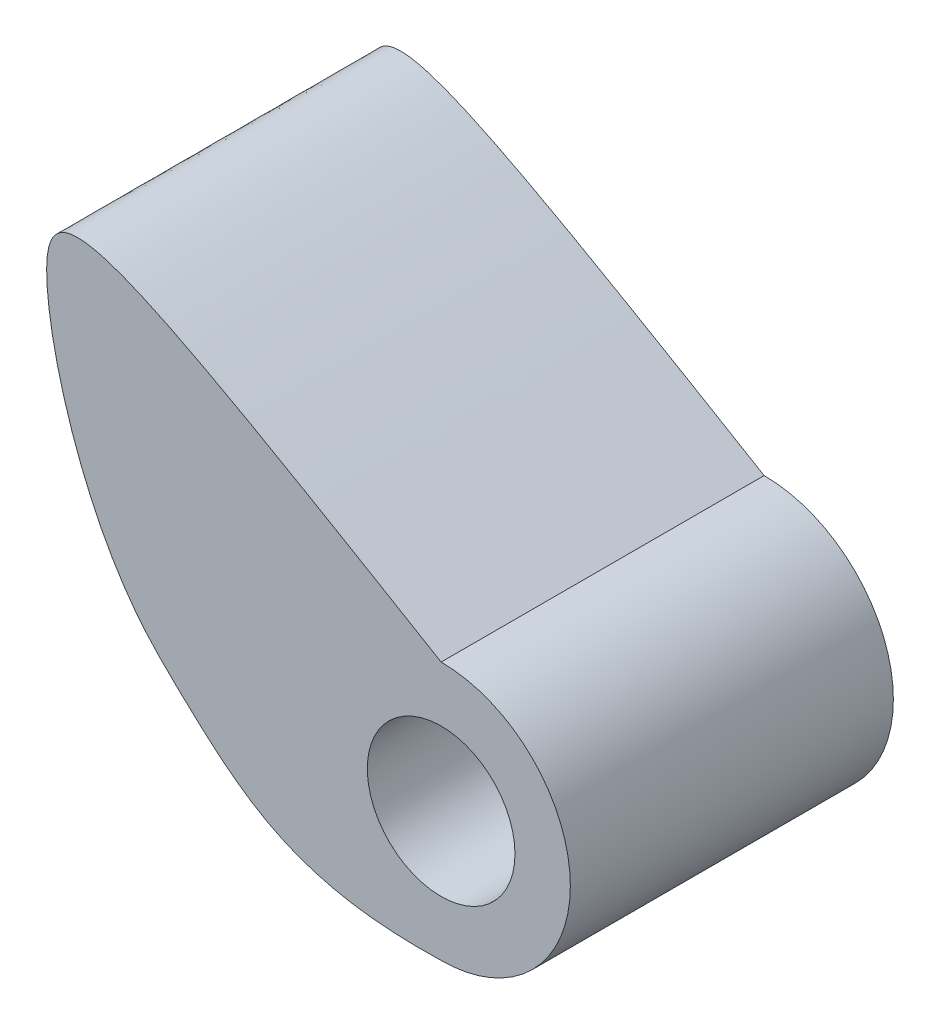
ISO-10303-21;
HEADER;
FILE_DESCRIPTION(('STEP AP214'),'2;1');
FILE_NAME('part.step','',(''),(''),'','','');
FILE_SCHEMA(('AUTOMOTIVE_DESIGN { 1 0 10303 214 1 1 1 1 }'));
ENDSEC;
DATA;
#1=APPLICATION_CONTEXT('core data for automotive mechanical design processes');
#2=APPLICATION_PROTOCOL_DEFINITION('international standard','automotive_design',2000,#1);
#3=PRODUCT_CONTEXT('',#1,'mechanical');
#4=PRODUCT('Part','Part','',(#3));
#5=PRODUCT_RELATED_PRODUCT_CATEGORY('part','',(#4));
#6=PRODUCT_DEFINITION_FORMATION('','',#4);
#7=PRODUCT_DEFINITION_CONTEXT('part definition',#1,'design');
#8=PRODUCT_DEFINITION('design','',#6,#7);
#9=PRODUCT_DEFINITION_SHAPE('','',#8);
#10=(LENGTH_UNIT() NAMED_UNIT(*) SI_UNIT(.MILLI.,.METRE.));
#11=(NAMED_UNIT(*) PLANE_ANGLE_UNIT() SI_UNIT($,.RADIAN.));
#12=(NAMED_UNIT(*) SI_UNIT($,.STERADIAN.) SOLID_ANGLE_UNIT());
#13=UNCERTAINTY_MEASURE_WITH_UNIT(LENGTH_MEASURE(1.E-05),#10,'distance_accuracy_value','');
#14=(GEOMETRIC_REPRESENTATION_CONTEXT(3) GLOBAL_UNCERTAINTY_ASSIGNED_CONTEXT((#13)) GLOBAL_UNIT_ASSIGNED_CONTEXT((#10,
#11,#12)) REPRESENTATION_CONTEXT('',''));
#15=CARTESIAN_POINT('',(0.,0.,0.));
#16=DIRECTION('',(0.,0.,1.));
#17=DIRECTION('',(1.,0.,0.));
#18=AXIS2_PLACEMENT_3D('',#15,#16,#17);
#19=CARTESIAN_POINT('',(0.,0.,-17.5));
#20=DIRECTION('',(0.,0.,1.));
#21=DIRECTION('',(1.,0.,0.));
#22=AXIS2_PLACEMENT_3D('',#19,#20,#21);
#23=CYLINDRICAL_SURFACE('',#22,7.);
#24=CARTESIAN_POINT('',(0.,0.,0.));
#25=DIRECTION('',(0.,0.,1.));
#26=DIRECTION('',(1.,0.,0.));
#27=AXIS2_PLACEMENT_3D('',#24,#25,#26);
#28=CIRCLE('',#27,7.);
#29=CARTESIAN_POINT('',(0.,-7.,0.));
#30=VERTEX_POINT('',#29);
#31=CARTESIAN_POINT('',(0.,7.,0.));
#32=VERTEX_POINT('',#31);
#33=EDGE_CURVE('E74',#30,#32,#28,.T.);
#34=ORIENTED_EDGE('',*,*,#33,.F.);
#35=DIRECTION('',(0.,0.,1.));
#36=VECTOR('',#35,1.);
#37=CARTESIAN_POINT('',(0.,-7.,-17.5));
#38=LINE('',#37,#36);
#39=CARTESIAN_POINT('',(0.,-7.,-17.5));
#40=VERTEX_POINT('',#39);
#41=EDGE_CURVE('E11',#40,#30,#38,.T.);
#42=ORIENTED_EDGE('',*,*,#41,.F.);
#43=CARTESIAN_POINT('',(0.,0.,-17.5));
#44=DIRECTION('',(0.,0.,1.));
#45=DIRECTION('',(1.,0.,0.));
#46=AXIS2_PLACEMENT_3D('',#43,#44,#45);
#47=CIRCLE('',#46,7.);
#48=CARTESIAN_POINT('',(0.,7.,-17.5));
#49=VERTEX_POINT('',#48);
#50=EDGE_CURVE('E91',#40,#49,#47,.T.);
#51=ORIENTED_EDGE('',*,*,#50,.T.);
#52=DIRECTION('',(0.,0.,1.));
#53=VECTOR('',#52,1.);
#54=CARTESIAN_POINT('',(0.,7.,-17.5));
#55=LINE('',#54,#53);
#56=EDGE_CURVE('E46',#49,#32,#55,.T.);
#57=ORIENTED_EDGE('',*,*,#56,.T.);
#58=EDGE_LOOP('',(#34,#42,#51,#57));
#59=FACE_BOUND('',#58,.T.);
#60=ADVANCED_FACE('F42',(#59),#23,.T.);
#61=CARTESIAN_POINT('',(0.,0.,-17.5));
#62=DIRECTION('',(0.,0.,1.));
#63=DIRECTION('',(1.,0.,0.));
#64=AXIS2_PLACEMENT_3D('',#61,#62,#63);
#65=CYLINDRICAL_SURFACE('',#64,4.);
#66=CARTESIAN_POINT('',(0.,0.,-17.5));
#67=DIRECTION('',(0.,0.,1.));
#68=DIRECTION('',(1.,0.,0.));
#69=AXIS2_PLACEMENT_3D('',#66,#67,#68);
#70=CIRCLE('',#69,4.);
#71=CARTESIAN_POINT('',(4.,0.,-17.5));
#72=VERTEX_POINT('',#71);
#73=EDGE_CURVE('E75',#72,#72,#70,.T.);
#74=ORIENTED_EDGE('',*,*,#73,.F.);
#75=EDGE_LOOP('',(#74));
#76=FACE_BOUND('',#75,.T.);
#77=CARTESIAN_POINT('',(0.,0.,0.));
#78=DIRECTION('',(0.,0.,1.));
#79=DIRECTION('',(1.,0.,0.));
#80=AXIS2_PLACEMENT_3D('',#77,#78,#79);
#81=CIRCLE('',#80,4.);
#82=CARTESIAN_POINT('',(4.,0.,0.));
#83=VERTEX_POINT('',#82);
#84=EDGE_CURVE('E77',#83,#83,#81,.T.);
#85=ORIENTED_EDGE('',*,*,#84,.T.);
#86=EDGE_LOOP('',(#85));
#87=FACE_BOUND('',#86,.T.);
#88=ADVANCED_FACE('F44',(#76,#87),#65,.F.);
#89=CARTESIAN_POINT('',(0.,-7.,-17.5));
#90=CARTESIAN_POINT('',(-7.67449029260172,-7.22440030095325,-17.5));
#91=CARTESIAN_POINT('',(-11.1284193296082,-4.41044745018422,-17.5));
#92=CARTESIAN_POINT('',(-19.0738660350983,3.25329944865006,-17.5));
#93=CARTESIAN_POINT('',(-23.9313937071178,20.6601730735232,-17.5));
#94=CARTESIAN_POINT('',(-17.9595485896225,17.6485819071213,-17.5));
#95=CARTESIAN_POINT('',(0.,7.,-17.5));
#96=B_SPLINE_CURVE_WITH_KNOTS('',3,(#89,#90,#91,#92,#93,#94,#95),.UNSPECIFIED.,.F.,.F.,(4,1,1,1,
4),(0.,0.270181839890117,0.32919941176701,0.590175718768924,1.),.UNSPECIFIED.);
#97=DIRECTION('',(0.,0.,1.));
#98=VECTOR('',#97,1.);
#99=SURFACE_OF_LINEAR_EXTRUSION('',#96,#98);
#100=CARTESIAN_POINT('',(0.,-7.,0.));
#101=CARTESIAN_POINT('',(-7.67449029260172,-7.22440030095325,0.));
#102=CARTESIAN_POINT('',(-11.1284193296082,-4.41044745018422,0.));
#103=CARTESIAN_POINT('',(-19.0738660350983,3.25329944865006,0.));
#104=CARTESIAN_POINT('',(-23.9313937071178,20.6601730735232,0.));
#105=CARTESIAN_POINT('',(-17.9595485896225,17.6485819071213,0.));
#106=CARTESIAN_POINT('',(0.,7.,0.));
#107=B_SPLINE_CURVE_WITH_KNOTS('',3,(#100,#101,#102,#103,#104,#105,#106),.UNSPECIFIED.,.F.,.F.,
(4,1,1,1,4),(0.,0.270181839890117,0.32919941176701,0.590175718768924,1.),.UNSPECIFIED.);
#108=EDGE_CURVE('E68',#30,#32,#107,.T.);
#109=ORIENTED_EDGE('',*,*,#108,.T.);
#110=ORIENTED_EDGE('',*,*,#56,.F.);
#111=EDGE_CURVE('E70',#40,#49,#96,.T.);
#112=ORIENTED_EDGE('',*,*,#111,.F.);
#113=ORIENTED_EDGE('',*,*,#41,.T.);
#114=EDGE_LOOP('',(#109,#110,#112,#113));
#115=FACE_BOUND('',#114,.T.);
#116=ADVANCED_FACE('F67',(#115),#99,.F.);
#117=CARTESIAN_POINT('',(0.,0.,-17.5));
#118=DIRECTION('',(0.,0.,1.));
#119=DIRECTION('',(1.,0.,0.));
#120=AXIS2_PLACEMENT_3D('',#117,#118,#119);
#121=PLANE('',#120);
#122=ORIENTED_EDGE('',*,*,#73,.T.);
#123=EDGE_LOOP('',(#122));
#124=FACE_BOUND('',#123,.T.);
#125=ORIENTED_EDGE('',*,*,#50,.F.);
#126=ORIENTED_EDGE('',*,*,#111,.T.);
#127=EDGE_LOOP('',(#125,#126));
#128=FACE_BOUND('',#127,.T.);
#129=ADVANCED_FACE('F99',(#124,#128),#121,.F.);
#130=CARTESIAN_POINT('',(0.,0.,0.));
#131=DIRECTION('',(0.,0.,1.));
#132=DIRECTION('',(1.,0.,0.));
#133=AXIS2_PLACEMENT_3D('',#130,#131,#132);
#134=PLANE('',#133);
#135=ORIENTED_EDGE('',*,*,#84,.F.);
#136=EDGE_LOOP('',(#135));
#137=FACE_BOUND('',#136,.T.);
#138=ORIENTED_EDGE('',*,*,#33,.T.);
#139=ORIENTED_EDGE('',*,*,#108,.F.);
#140=EDGE_LOOP('',(#138,#139));
#141=FACE_BOUND('',#140,.T.);
#142=ADVANCED_FACE('F73',(#137,#141),#134,.T.);
#143=CLOSED_SHELL('',(#60,#88,#116,#129,#142));
#144=MANIFOLD_SOLID_BREP('B2',#143);
#145=ADVANCED_BREP_SHAPE_REPRESENTATION('',(#18,#144),#14);
#146=SHAPE_DEFINITION_REPRESENTATION(#9,#145);
ENDSEC;
END-ISO-10303-21;
